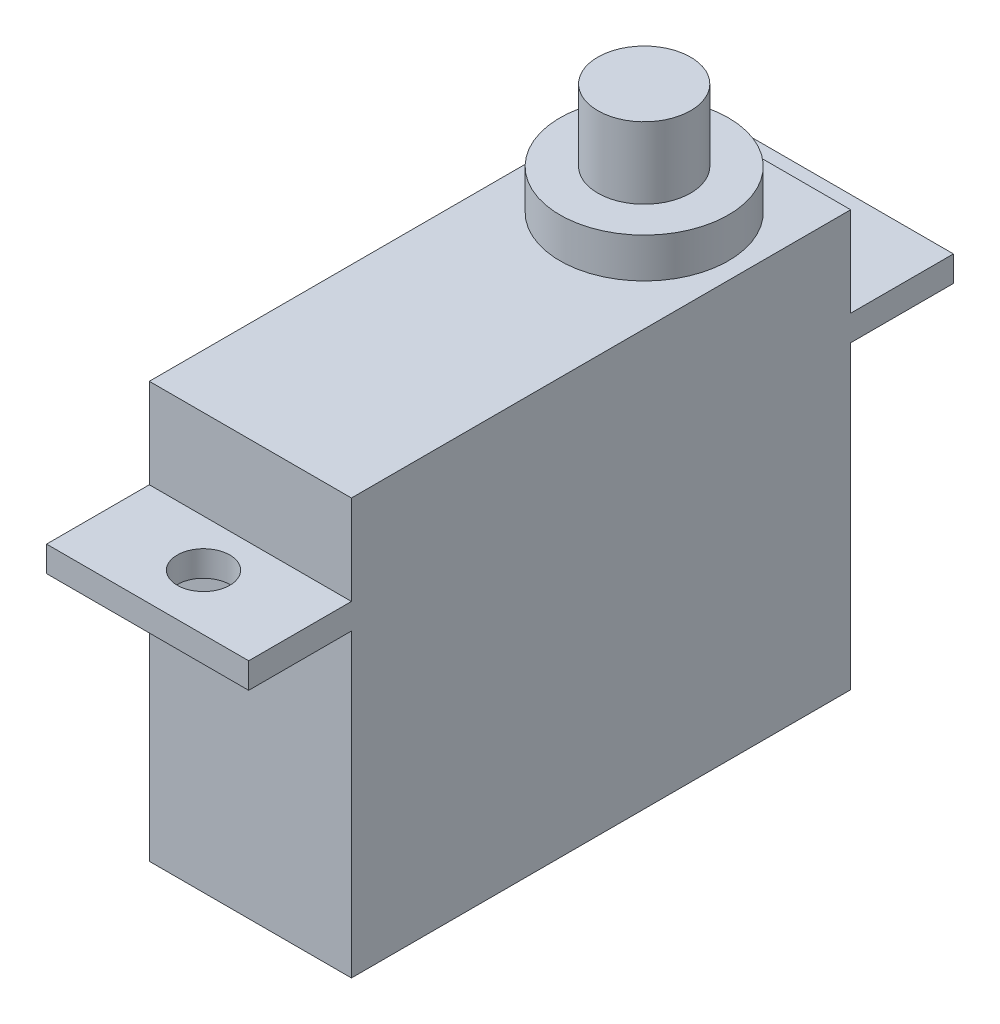
ISO-10303-21;
HEADER;
FILE_DESCRIPTION(('STEP AP214'),'2;1');
FILE_NAME('part.step','',(''),(''),'','','');
FILE_SCHEMA(('AUTOMOTIVE_DESIGN { 1 0 10303 214 1 1 1 1 }'));
ENDSEC;
DATA;
#1=APPLICATION_CONTEXT('core data for automotive mechanical design processes');
#2=APPLICATION_PROTOCOL_DEFINITION('international standard','automotive_design',2000,#1);
#3=PRODUCT_CONTEXT('',#1,'mechanical');
#4=PRODUCT('Part','Part','',(#3));
#5=PRODUCT_RELATED_PRODUCT_CATEGORY('part','',(#4));
#6=PRODUCT_DEFINITION_FORMATION('','',#4);
#7=PRODUCT_DEFINITION_CONTEXT('part definition',#1,'design');
#8=PRODUCT_DEFINITION('design','',#6,#7);
#9=PRODUCT_DEFINITION_SHAPE('','',#8);
#10=(LENGTH_UNIT() NAMED_UNIT(*) SI_UNIT(.MILLI.,.METRE.));
#11=(NAMED_UNIT(*) PLANE_ANGLE_UNIT() SI_UNIT($,.RADIAN.));
#12=(NAMED_UNIT(*) SI_UNIT($,.STERADIAN.) SOLID_ANGLE_UNIT());
#13=UNCERTAINTY_MEASURE_WITH_UNIT(LENGTH_MEASURE(1.E-05),#10,'distance_accuracy_value','');
#14=(GEOMETRIC_REPRESENTATION_CONTEXT(3) GLOBAL_UNCERTAINTY_ASSIGNED_CONTEXT((#13)) GLOBAL_UNIT_ASSIGNED_CONTEXT((#10,
#11,#12)) REPRESENTATION_CONTEXT('',''));
#15=CARTESIAN_POINT('',(0.,0.,0.));
#16=DIRECTION('',(0.,0.,1.));
#17=DIRECTION('',(1.,0.,0.));
#18=AXIS2_PLACEMENT_3D('',#15,#16,#17);
#19=CARTESIAN_POINT('',(3.81,17.1704,-14.8463));
#20=DIRECTION('',(0.,1.,0.));
#21=DIRECTION('',(0.,0.,1.));
#22=AXIS2_PLACEMENT_3D('',#19,#20,#21);
#23=PLANE('',#22);
#24=CARTESIAN_POINT('',(3.81,17.1704,-14.8463));
#25=DIRECTION('',(0.,1.,0.));
#26=DIRECTION('',(0.,0.,1.));
#27=AXIS2_PLACEMENT_3D('',#24,#25,#26);
#28=CIRCLE('',#27,3.175);
#29=CARTESIAN_POINT('',(3.81,17.1704,-18.0213));
#30=VERTEX_POINT('',#29);
#31=EDGE_CURVE('E346',#30,#30,#28,.T.);
#32=ORIENTED_EDGE('',*,*,#31,.T.);
#33=EDGE_LOOP('',(#32));
#34=FACE_BOUND('',#33,.T.);
#35=CARTESIAN_POINT('',(3.81,17.1704,-14.8463));
#36=DIRECTION('',(0.,1.,0.));
#37=DIRECTION('',(0.,0.,1.));
#38=AXIS2_PLACEMENT_3D('',#35,#36,#37);
#39=CIRCLE('',#38,1.75);
#40=CARTESIAN_POINT('',(3.81,17.1704,-13.0963));
#41=VERTEX_POINT('',#40);
#42=EDGE_CURVE('E350',#41,#41,#39,.T.);
#43=ORIENTED_EDGE('',*,*,#42,.F.);
#44=EDGE_LOOP('',(#43));
#45=FACE_BOUND('',#44,.T.);
#46=ADVANCED_FACE('F37',(#34,#45),#23,.T.);
#47=CARTESIAN_POINT('',(0.,15.6718,0.));
#48=DIRECTION('',(0.,-1.,0.));
#49=DIRECTION('',(0.,0.,-1.));
#50=AXIS2_PLACEMENT_3D('',#47,#48,#49);
#51=PLANE('',#50);
#52=DIRECTION('',(0.,0.,1.));
#53=VECTOR('',#52,1.);
#54=CARTESIAN_POINT('',(0.,15.6718,0.));
#55=LINE('',#54,#53);
#56=CARTESIAN_POINT('',(0.,15.6718,-18.8214));
#57=VERTEX_POINT('',#56);
#58=CARTESIAN_POINT('',(0.,15.6718,0.));
#59=VERTEX_POINT('',#58);
#60=EDGE_CURVE('E213',#57,#59,#55,.T.);
#61=ORIENTED_EDGE('',*,*,#60,.T.);
#62=DIRECTION('',(1.,0.,0.));
#63=VECTOR('',#62,1.);
#64=CARTESIAN_POINT('',(0.,15.6718,0.));
#65=LINE('',#64,#63);
#66=CARTESIAN_POINT('',(7.62,15.6718,0.));
#67=VERTEX_POINT('',#66);
#68=EDGE_CURVE('E216',#59,#67,#65,.T.);
#69=ORIENTED_EDGE('',*,*,#68,.T.);
#70=DIRECTION('',(0.,0.,-1.));
#71=VECTOR('',#70,1.);
#72=CARTESIAN_POINT('',(7.62,15.6718,0.));
#73=LINE('',#72,#71);
#74=CARTESIAN_POINT('',(7.62,15.6718,-18.8214));
#75=VERTEX_POINT('',#74);
#76=EDGE_CURVE('E219',#67,#75,#73,.T.);
#77=ORIENTED_EDGE('',*,*,#76,.T.);
#78=DIRECTION('',(-1.,0.,0.));
#79=VECTOR('',#78,1.);
#80=CARTESIAN_POINT('',(0.,15.6718,-18.8214));
#81=LINE('',#80,#79);
#82=EDGE_CURVE('E221',#75,#57,#81,.T.);
#83=ORIENTED_EDGE('',*,*,#82,.T.);
#84=EDGE_LOOP('',(#61,#69,#77,#83));
#85=FACE_BOUND('',#84,.T.);
#86=CARTESIAN_POINT('',(3.81,15.6718,-14.8463));
#87=DIRECTION('',(0.,-1.,0.));
#88=DIRECTION('',(0.,0.,-1.));
#89=AXIS2_PLACEMENT_3D('',#86,#87,#88);
#90=CIRCLE('',#89,3.175);
#91=CARTESIAN_POINT('',(3.81,15.6718,-18.0213));
#92=VERTEX_POINT('',#91);
#93=EDGE_CURVE('E11',#92,#92,#90,.F.);
#94=ORIENTED_EDGE('',*,*,#93,.F.);
#95=EDGE_LOOP('',(#94));
#96=FACE_BOUND('',#95,.T.);
#97=ADVANCED_FACE('F283',(#85,#96),#51,.F.);
#98=CARTESIAN_POINT('',(0.,15.6718,-18.8214));
#99=DIRECTION('',(0.,0.,1.));
#100=DIRECTION('',(1.,0.,0.));
#101=AXIS2_PLACEMENT_3D('',#98,#99,#100);
#102=PLANE('',#101);
#103=DIRECTION('',(1.,0.,0.));
#104=VECTOR('',#103,1.);
#105=CARTESIAN_POINT('',(0.,12.2936,-18.8214));
#106=LINE('',#105,#104);
#107=CARTESIAN_POINT('',(0.,12.2936,-18.8214));
#108=VERTEX_POINT('',#107);
#109=CARTESIAN_POINT('',(7.62,12.2936,-18.8214));
#110=VERTEX_POINT('',#109);
#111=EDGE_CURVE('E132',#108,#110,#106,.T.);
#112=ORIENTED_EDGE('',*,*,#111,.F.);
#113=DIRECTION('',(0.,-1.,0.));
#114=VECTOR('',#113,1.);
#115=CARTESIAN_POINT('',(0.,15.6718,-18.8214));
#116=LINE('',#115,#114);
#117=EDGE_CURVE('E239',#57,#108,#116,.T.);
#118=ORIENTED_EDGE('',*,*,#117,.F.);
#119=ORIENTED_EDGE('',*,*,#82,.F.);
#120=DIRECTION('',(0.,-1.,0.));
#121=VECTOR('',#120,1.);
#122=CARTESIAN_POINT('',(7.62,15.6718,-18.8214));
#123=LINE('',#122,#121);
#124=EDGE_CURVE('E246',#75,#110,#123,.T.);
#125=ORIENTED_EDGE('',*,*,#124,.T.);
#126=EDGE_LOOP('',(#112,#118,#119,#125));
#127=FACE_BOUND('',#126,.T.);
#128=ADVANCED_FACE('F278',(#127),#102,.F.);
#129=CARTESIAN_POINT('',(0.,15.6718,0.));
#130=DIRECTION('',(0.,0.,-1.));
#131=DIRECTION('',(-1.,0.,0.));
#132=AXIS2_PLACEMENT_3D('',#129,#130,#131);
#133=PLANE('',#132);
#134=DIRECTION('',(1.,0.,0.));
#135=VECTOR('',#134,1.);
#136=CARTESIAN_POINT('',(0.,11.3284,0.));
#137=LINE('',#136,#135);
#138=CARTESIAN_POINT('',(0.,11.3284,0.));
#139=VERTEX_POINT('',#138);
#140=CARTESIAN_POINT('',(7.62,11.3284,0.));
#141=VERTEX_POINT('',#140);
#142=EDGE_CURVE('E196',#139,#141,#137,.T.);
#143=ORIENTED_EDGE('',*,*,#142,.F.);
#144=DIRECTION('',(0.,-1.,0.));
#145=VECTOR('',#144,1.);
#146=CARTESIAN_POINT('',(0.,15.6718,0.));
#147=LINE('',#146,#145);
#148=CARTESIAN_POINT('',(0.,0.,0.));
#149=VERTEX_POINT('',#148);
#150=EDGE_CURVE('E263',#139,#149,#147,.T.);
#151=ORIENTED_EDGE('',*,*,#150,.T.);
#152=DIRECTION('',(1.,0.,0.));
#153=VECTOR('',#152,1.);
#154=CARTESIAN_POINT('',(0.,0.,0.));
#155=LINE('',#154,#153);
#156=CARTESIAN_POINT('',(7.62,0.,0.));
#157=VERTEX_POINT('',#156);
#158=EDGE_CURVE('E225',#149,#157,#155,.T.);
#159=ORIENTED_EDGE('',*,*,#158,.T.);
#160=DIRECTION('',(0.,-1.,0.));
#161=VECTOR('',#160,1.);
#162=CARTESIAN_POINT('',(7.62,15.6718,0.));
#163=LINE('',#162,#161);
#164=EDGE_CURVE('E262',#141,#157,#163,.T.);
#165=ORIENTED_EDGE('',*,*,#164,.F.);
#166=EDGE_LOOP('',(#143,#151,#159,#165));
#167=FACE_BOUND('',#166,.T.);
#168=ADVANCED_FACE('F261',(#167),#133,.F.);
#169=CARTESIAN_POINT('',(0.,15.6718,0.));
#170=DIRECTION('',(1.,0.,0.));
#171=DIRECTION('',(0.,0.,-1.));
#172=AXIS2_PLACEMENT_3D('',#169,#170,#171);
#173=PLANE('',#172);
#174=DIRECTION('',(0.,0.,1.));
#175=VECTOR('',#174,1.);
#176=CARTESIAN_POINT('',(0.,0.,0.));
#177=LINE('',#176,#175);
#178=CARTESIAN_POINT('',(0.,0.,-18.8214));
#179=VERTEX_POINT('',#178);
#180=EDGE_CURVE('E209',#179,#149,#177,.T.);
#181=ORIENTED_EDGE('',*,*,#180,.T.);
#182=ORIENTED_EDGE('',*,*,#150,.F.);
#183=DIRECTION('',(0.,0.,1.));
#184=VECTOR('',#183,1.);
#185=CARTESIAN_POINT('',(0.,11.3284,0.));
#186=LINE('',#185,#184);
#187=CARTESIAN_POINT('',(0.,11.3284,3.8735));
#188=VERTEX_POINT('',#187);
#189=EDGE_CURVE('E194',#139,#188,#186,.T.);
#190=ORIENTED_EDGE('',*,*,#189,.T.);
#191=DIRECTION('',(0.,-1.,0.));
#192=VECTOR('',#191,1.);
#193=CARTESIAN_POINT('',(0.,12.2936,3.8735));
#194=LINE('',#193,#192);
#195=CARTESIAN_POINT('',(0.,12.2936,3.8735));
#196=VERTEX_POINT('',#195);
#197=EDGE_CURVE('E210',#196,#188,#194,.T.);
#198=ORIENTED_EDGE('',*,*,#197,.F.);
#199=DIRECTION('',(0.,0.,1.));
#200=VECTOR('',#199,1.);
#201=CARTESIAN_POINT('',(0.,12.2936,0.));
#202=LINE('',#201,#200);
#203=CARTESIAN_POINT('',(0.,12.2936,0.));
#204=VERTEX_POINT('',#203);
#205=EDGE_CURVE('E177',#204,#196,#202,.T.);
#206=ORIENTED_EDGE('',*,*,#205,.F.);
#207=EDGE_CURVE('E45',#59,#204,#147,.T.);
#208=ORIENTED_EDGE('',*,*,#207,.F.);
#209=ORIENTED_EDGE('',*,*,#60,.F.);
#210=ORIENTED_EDGE('',*,*,#117,.T.);
#211=DIRECTION('',(0.,0.,-1.));
#212=VECTOR('',#211,1.);
#213=CARTESIAN_POINT('',(0.,12.2936,0.));
#214=LINE('',#213,#212);
#215=CARTESIAN_POINT('',(0.,12.2936,-22.6949));
#216=VERTEX_POINT('',#215);
#217=EDGE_CURVE('E146',#108,#216,#214,.T.);
#218=ORIENTED_EDGE('',*,*,#217,.T.);
#219=DIRECTION('',(0.,-1.,0.));
#220=VECTOR('',#219,1.);
#221=CARTESIAN_POINT('',(0.,12.2936,-22.6949));
#222=LINE('',#221,#220);
#223=CARTESIAN_POINT('',(0.,11.3284,-22.6949));
#224=VERTEX_POINT('',#223);
#225=EDGE_CURVE('E145',#216,#224,#222,.T.);
#226=ORIENTED_EDGE('',*,*,#225,.T.);
#227=DIRECTION('',(0.,0.,-1.));
#228=VECTOR('',#227,1.);
#229=CARTESIAN_POINT('',(0.,11.3284,0.));
#230=LINE('',#229,#228);
#231=CARTESIAN_POINT('',(0.,11.3284,-18.8214));
#232=VERTEX_POINT('',#231);
#233=EDGE_CURVE('E152',#232,#224,#230,.T.);
#234=ORIENTED_EDGE('',*,*,#233,.F.);
#235=EDGE_CURVE('E57',#232,#179,#116,.T.);
#236=ORIENTED_EDGE('',*,*,#235,.T.);
#237=EDGE_LOOP('',(#181,#182,#190,#198,#206,#208,#209,#210,#218,#226,#234,#236));
#238=FACE_BOUND('',#237,.T.);
#239=ADVANCED_FACE('F39',(#238),#173,.F.);
#240=ORIENTED_EDGE('',*,*,#207,.T.);
#241=DIRECTION('',(1.,0.,0.));
#242=VECTOR('',#241,1.);
#243=CARTESIAN_POINT('',(0.,12.2936,0.));
#244=LINE('',#243,#242);
#245=CARTESIAN_POINT('',(7.62,12.2936,0.));
#246=VERTEX_POINT('',#245);
#247=EDGE_CURVE('E184',#204,#246,#244,.T.);
#248=ORIENTED_EDGE('',*,*,#247,.T.);
#249=EDGE_CURVE('E264',#67,#246,#163,.T.);
#250=ORIENTED_EDGE('',*,*,#249,.F.);
#251=ORIENTED_EDGE('',*,*,#68,.F.);
#252=EDGE_LOOP('',(#240,#248,#250,#251));
#253=FACE_BOUND('',#252,.T.);
#254=ADVANCED_FACE('F287',(#253),#133,.F.);
#255=CARTESIAN_POINT('',(7.62,15.6718,0.));
#256=DIRECTION('',(-1.,0.,0.));
#257=DIRECTION('',(0.,0.,1.));
#258=AXIS2_PLACEMENT_3D('',#255,#256,#257);
#259=PLANE('',#258);
#260=DIRECTION('',(0.,0.,-1.));
#261=VECTOR('',#260,1.);
#262=CARTESIAN_POINT('',(7.62,0.,0.));
#263=LINE('',#262,#261);
#264=CARTESIAN_POINT('',(7.62,0.,-18.8214));
#265=VERTEX_POINT('',#264);
#266=EDGE_CURVE('E228',#157,#265,#263,.T.);
#267=ORIENTED_EDGE('',*,*,#266,.T.);
#268=CARTESIAN_POINT('',(7.62,11.3284,-18.8214));
#269=VERTEX_POINT('',#268);
#270=EDGE_CURVE('E241',#269,#265,#123,.T.);
#271=ORIENTED_EDGE('',*,*,#270,.F.);
#272=DIRECTION('',(0.,0.,-1.));
#273=VECTOR('',#272,1.);
#274=CARTESIAN_POINT('',(7.62,11.3284,0.));
#275=LINE('',#274,#273);
#276=CARTESIAN_POINT('',(7.62,11.3284,-22.6949));
#277=VERTEX_POINT('',#276);
#278=EDGE_CURVE('E141',#269,#277,#275,.T.);
#279=ORIENTED_EDGE('',*,*,#278,.T.);
#280=DIRECTION('',(0.,-1.,0.));
#281=VECTOR('',#280,1.);
#282=CARTESIAN_POINT('',(7.62,12.2936,-22.6949));
#283=LINE('',#282,#281);
#284=CARTESIAN_POINT('',(7.62,12.2936,-22.6949));
#285=VERTEX_POINT('',#284);
#286=EDGE_CURVE('E137',#285,#277,#283,.T.);
#287=ORIENTED_EDGE('',*,*,#286,.F.);
#288=DIRECTION('',(0.,0.,-1.));
#289=VECTOR('',#288,1.);
#290=CARTESIAN_POINT('',(7.62,12.2936,0.));
#291=LINE('',#290,#289);
#292=EDGE_CURVE('E125',#110,#285,#291,.T.);
#293=ORIENTED_EDGE('',*,*,#292,.F.);
#294=ORIENTED_EDGE('',*,*,#124,.F.);
#295=ORIENTED_EDGE('',*,*,#76,.F.);
#296=ORIENTED_EDGE('',*,*,#249,.T.);
#297=DIRECTION('',(0.,0.,1.));
#298=VECTOR('',#297,1.);
#299=CARTESIAN_POINT('',(7.62,12.2936,0.));
#300=LINE('',#299,#298);
#301=CARTESIAN_POINT('',(7.62,12.2936,3.8735));
#302=VERTEX_POINT('',#301);
#303=EDGE_CURVE('E188',#246,#302,#300,.T.);
#304=ORIENTED_EDGE('',*,*,#303,.T.);
#305=DIRECTION('',(0.,-1.,0.));
#306=VECTOR('',#305,1.);
#307=CARTESIAN_POINT('',(7.62,12.2936,3.8735));
#308=LINE('',#307,#306);
#309=CARTESIAN_POINT('',(7.62,11.3284,3.8735));
#310=VERTEX_POINT('',#309);
#311=EDGE_CURVE('E207',#302,#310,#308,.T.);
#312=ORIENTED_EDGE('',*,*,#311,.T.);
#313=DIRECTION('',(0.,0.,1.));
#314=VECTOR('',#313,1.);
#315=CARTESIAN_POINT('',(7.62,11.3284,0.));
#316=LINE('',#315,#314);
#317=EDGE_CURVE('E201',#141,#310,#316,.T.);
#318=ORIENTED_EDGE('',*,*,#317,.F.);
#319=ORIENTED_EDGE('',*,*,#164,.T.);
#320=EDGE_LOOP('',(#267,#271,#279,#287,#293,#294,#295,#296,#304,#312,#318,#319));
#321=FACE_BOUND('',#320,.T.);
#322=ADVANCED_FACE('F139',(#321),#259,.F.);
#323=ORIENTED_EDGE('',*,*,#235,.F.);
#324=DIRECTION('',(1.,0.,0.));
#325=VECTOR('',#324,1.);
#326=CARTESIAN_POINT('',(0.,11.3284,-18.8214));
#327=LINE('',#326,#325);
#328=EDGE_CURVE('E52',#232,#269,#327,.T.);
#329=ORIENTED_EDGE('',*,*,#328,.T.);
#330=ORIENTED_EDGE('',*,*,#270,.T.);
#331=DIRECTION('',(-1.,0.,0.));
#332=VECTOR('',#331,1.);
#333=CARTESIAN_POINT('',(0.,0.,-18.8214));
#334=LINE('',#333,#332);
#335=EDGE_CURVE('E217',#265,#179,#334,.T.);
#336=ORIENTED_EDGE('',*,*,#335,.T.);
#337=EDGE_LOOP('',(#323,#329,#330,#336));
#338=FACE_BOUND('',#337,.T.);
#339=ADVANCED_FACE('F253',(#338),#102,.F.);
#340=CARTESIAN_POINT('',(0.,0.,0.));
#341=DIRECTION('',(0.,-1.,0.));
#342=DIRECTION('',(0.,0.,-1.));
#343=AXIS2_PLACEMENT_3D('',#340,#341,#342);
#344=PLANE('',#343);
#345=ORIENTED_EDGE('',*,*,#180,.F.);
#346=ORIENTED_EDGE('',*,*,#335,.F.);
#347=ORIENTED_EDGE('',*,*,#266,.F.);
#348=ORIENTED_EDGE('',*,*,#158,.F.);
#349=EDGE_LOOP('',(#345,#346,#347,#348));
#350=FACE_BOUND('',#349,.T.);
#351=ADVANCED_FACE('F257',(#350),#344,.T.);
#352=CARTESIAN_POINT('',(0.,12.2936,3.8735));
#353=DIRECTION('',(0.,0.,-1.));
#354=DIRECTION('',(-1.,0.,0.));
#355=AXIS2_PLACEMENT_3D('',#352,#353,#354);
#356=PLANE('',#355);
#357=DIRECTION('',(1.,0.,0.));
#358=VECTOR('',#357,1.);
#359=CARTESIAN_POINT('',(0.,11.3284,3.8735));
#360=LINE('',#359,#358);
#361=EDGE_CURVE('E173',#188,#310,#360,.T.);
#362=ORIENTED_EDGE('',*,*,#361,.T.);
#363=ORIENTED_EDGE('',*,*,#311,.F.);
#364=DIRECTION('',(1.,0.,0.));
#365=VECTOR('',#364,1.);
#366=CARTESIAN_POINT('',(0.,12.2936,3.8735));
#367=LINE('',#366,#365);
#368=EDGE_CURVE('E175',#196,#302,#367,.T.);
#369=ORIENTED_EDGE('',*,*,#368,.F.);
#370=ORIENTED_EDGE('',*,*,#197,.T.);
#371=EDGE_LOOP('',(#362,#363,#369,#370));
#372=FACE_BOUND('',#371,.T.);
#373=ADVANCED_FACE('F309',(#372),#356,.F.);
#374=CARTESIAN_POINT('',(3.81,12.2936,1.7653));
#375=DIRECTION('',(0.,-1.,0.));
#376=DIRECTION('',(0.,0.,-1.));
#377=AXIS2_PLACEMENT_3D('',#374,#375,#376);
#378=CYLINDRICAL_SURFACE('',#377,0.990600000000004);
#379=CARTESIAN_POINT('',(3.81,12.2936,1.7653));
#380=DIRECTION('',(0.,-1.,0.));
#381=DIRECTION('',(0.,0.,-1.));
#382=AXIS2_PLACEMENT_3D('',#379,#380,#381);
#383=CIRCLE('',#382,0.990600000000004);
#384=CARTESIAN_POINT('',(3.81,12.2936,0.774699999999997));
#385=VERTEX_POINT('',#384);
#386=EDGE_CURVE('E181',#385,#385,#383,.F.);
#387=CARTESIAN_POINT('',(3.81,11.3284,1.7653));
#388=DIRECTION('',(0.,-1.,0.));
#389=DIRECTION('',(0.,0.,-1.));
#390=AXIS2_PLACEMENT_3D('',#387,#388,#389);
#391=CIRCLE('',#390,0.990600000000004);
#392=CARTESIAN_POINT('',(3.81,11.3284,0.774699999999997));
#393=VERTEX_POINT('',#392);
#394=EDGE_CURVE('E178',#393,#393,#391,.F.);
#395=CARTESIAN_POINT('',(3.81,12.2936,0.774699999999997));
#396=CARTESIAN_POINT('',(3.81,12.2835458333333,0.774699999999997));
#397=CARTESIAN_POINT('',(3.81,12.2734916666667,0.774699999999997));
#398=CARTESIAN_POINT('',(3.81,12.2533833333333,0.774699999999997));
#399=CARTESIAN_POINT('',(3.81,12.2433291666667,0.774699999999997));
#400=CARTESIAN_POINT('',(3.81,12.2232208333333,0.774699999999997));
#401=CARTESIAN_POINT('',(3.81,12.2131666666667,0.774699999999997));
#402=CARTESIAN_POINT('',(3.81,12.1930583333333,0.774699999999997));
#403=CARTESIAN_POINT('',(3.81,12.1830041666667,0.774699999999997));
#404=CARTESIAN_POINT('',(3.81,12.1628958333333,0.774699999999997));
#405=CARTESIAN_POINT('',(3.81,12.1528416666667,0.774699999999997));
#406=CARTESIAN_POINT('',(3.81,12.1327333333333,0.774699999999997));
#407=CARTESIAN_POINT('',(3.81,12.1226791666667,0.774699999999997));
#408=CARTESIAN_POINT('',(3.81,12.1025708333333,0.774699999999997));
#409=CARTESIAN_POINT('',(3.81,12.0925166666667,0.774699999999997));
#410=CARTESIAN_POINT('',(3.81,12.0724083333333,0.774699999999997));
#411=CARTESIAN_POINT('',(3.81,12.0623541666667,0.774699999999997));
#412=CARTESIAN_POINT('',(3.81,12.0422458333333,0.774699999999997));
#413=CARTESIAN_POINT('',(3.81,12.0321916666667,0.774699999999997));
#414=CARTESIAN_POINT('',(3.81,12.0120833333333,0.774699999999997));
#415=CARTESIAN_POINT('',(3.81,12.0020291666667,0.774699999999997));
#416=CARTESIAN_POINT('',(3.81,11.9819208333333,0.774699999999997));
#417=CARTESIAN_POINT('',(3.81,11.9718666666667,0.774699999999997));
#418=CARTESIAN_POINT('',(3.81,11.9517583333333,0.774699999999997));
#419=CARTESIAN_POINT('',(3.81,11.9417041666667,0.774699999999997));
#420=CARTESIAN_POINT('',(3.81,11.9215958333333,0.774699999999997));
#421=CARTESIAN_POINT('',(3.81,11.9115416666667,0.774699999999997));
#422=CARTESIAN_POINT('',(3.81,11.8914333333333,0.774699999999997));
#423=CARTESIAN_POINT('',(3.81,11.8813791666667,0.774699999999997));
#424=CARTESIAN_POINT('',(3.81,11.8612708333333,0.774699999999997));
#425=CARTESIAN_POINT('',(3.81,11.8512166666667,0.774699999999997));
#426=CARTESIAN_POINT('',(3.81,11.8311083333333,0.774699999999997));
#427=CARTESIAN_POINT('',(3.81,11.8210541666667,0.774699999999997));
#428=CARTESIAN_POINT('',(3.81,11.8009458333333,0.774699999999997));
#429=CARTESIAN_POINT('',(3.81,11.7908916666667,0.774699999999997));
#430=CARTESIAN_POINT('',(3.81,11.7707833333333,0.774699999999997));
#431=CARTESIAN_POINT('',(3.81,11.7607291666667,0.774699999999997));
#432=CARTESIAN_POINT('',(3.81,11.7406208333333,0.774699999999997));
#433=CARTESIAN_POINT('',(3.81,11.7305666666667,0.774699999999997));
#434=CARTESIAN_POINT('',(3.81,11.7104583333333,0.774699999999997));
#435=CARTESIAN_POINT('',(3.81,11.7004041666667,0.774699999999997));
#436=CARTESIAN_POINT('',(3.81,11.6802958333333,0.774699999999997));
#437=CARTESIAN_POINT('',(3.81,11.6702416666667,0.774699999999997));
#438=CARTESIAN_POINT('',(3.81,11.6501333333333,0.774699999999997));
#439=CARTESIAN_POINT('',(3.81,11.6400791666667,0.774699999999997));
#440=CARTESIAN_POINT('',(3.81,11.6199708333333,0.774699999999997));
#441=CARTESIAN_POINT('',(3.81,11.6099166666667,0.774699999999997));
#442=CARTESIAN_POINT('',(3.81,11.5898083333333,0.774699999999997));
#443=CARTESIAN_POINT('',(3.81,11.5797541666667,0.774699999999997));
#444=CARTESIAN_POINT('',(3.81,11.5596458333333,0.774699999999997));
#445=CARTESIAN_POINT('',(3.81,11.5495916666667,0.774699999999997));
#446=CARTESIAN_POINT('',(3.81,11.5294833333333,0.774699999999997));
#447=CARTESIAN_POINT('',(3.81,11.5194291666667,0.774699999999997));
#448=CARTESIAN_POINT('',(3.81,11.4993208333333,0.774699999999997));
#449=CARTESIAN_POINT('',(3.81,11.4892666666667,0.774699999999997));
#450=CARTESIAN_POINT('',(3.81,11.4691583333333,0.774699999999997));
#451=CARTESIAN_POINT('',(3.81,11.4591041666667,0.774699999999997));
#452=CARTESIAN_POINT('',(3.81,11.4389958333333,0.774699999999997));
#453=CARTESIAN_POINT('',(3.81,11.4289416666667,0.774699999999997));
#454=CARTESIAN_POINT('',(3.81,11.4088333333333,0.774699999999997));
#455=CARTESIAN_POINT('',(3.81,11.3987791666667,0.774699999999997));
#456=CARTESIAN_POINT('',(3.81,11.3786708333333,0.774699999999997));
#457=CARTESIAN_POINT('',(3.81,11.3686166666667,0.774699999999997));
#458=CARTESIAN_POINT('',(3.81,11.3485083333333,0.774699999999997));
#459=CARTESIAN_POINT('',(3.81,11.3384541666667,0.774699999999997));
#460=CARTESIAN_POINT('',(3.81,11.3284,0.774699999999997));
#461=B_SPLINE_CURVE_WITH_KNOTS('',3,(#395,#396,#397,#398,#399,#400,#401,#402,#403,#404,#405,
#406,#407,#408,#409,#410,#411,#412,#413,#414,#415,#416,#417,#418,#419,#420,#421,#422,#423,#424,
#425,#426,#427,#428,#429,#430,#431,#432,#433,#434,#435,#436,#437,#438,#439,#440,#441,#442,#443,
#444,#445,#446,#447,#448,#449,#450,#451,#452,#453,#454,#455,#456,#457,#458,#459,#460),
.UNSPECIFIED.,.F.,.F.,(4,2,2,2,2,2,2,2,2,2,2,2,2,2,2,2,2,2,2,2,2,2,2,2,2,2,2,2,2,2,2,2,4),(0.,
0.0301625000000017,0.0603250000000017,0.0904875000000017,0.120650000000002,0.1508125,
0.180975000000002,0.211137500000002,0.241300000000002,0.2714625,0.301625,0.3317875,
0.361950000000001,0.392112500000001,0.422275000000001,0.452437500000001,0.482600000000001,
0.5127625,0.542925,0.5730875,0.60325,0.6334125,0.663575,0.6937375,0.723900000000001,
0.754062500000001,0.784225000000001,0.814387500000001,0.844550000000001,0.874712500000001,
0.904875000000001,0.935037500000001,0.965200000000001),.UNSPECIFIED.);
#462=EDGE_CURVE('BSEAM298',#385,#393,#461,.T.);
#463=ORIENTED_EDGE('',*,*,#386,.T.);
#464=ORIENTED_EDGE('',*,*,#394,.F.);
#465=ORIENTED_EDGE('',*,*,#462,.T.);
#466=ORIENTED_EDGE('',*,*,#462,.F.);
#467=EDGE_LOOP('',(#463,#465,#464,#466));
#468=FACE_BOUND('',#467,.T.);
#469=ADVANCED_FACE('F298',(#468),#378,.F.);
#470=CARTESIAN_POINT('',(0.,12.2936,0.));
#471=DIRECTION('',(0.,-1.,0.));
#472=DIRECTION('',(0.,0.,-1.));
#473=AXIS2_PLACEMENT_3D('',#470,#471,#472);
#474=PLANE('',#473);
#475=ORIENTED_EDGE('',*,*,#368,.T.);
#476=ORIENTED_EDGE('',*,*,#303,.F.);
#477=ORIENTED_EDGE('',*,*,#247,.F.);
#478=ORIENTED_EDGE('',*,*,#205,.T.);
#479=EDGE_LOOP('',(#475,#476,#477,#478));
#480=FACE_BOUND('',#479,.T.);
#481=ORIENTED_EDGE('',*,*,#386,.F.);
#482=EDGE_LOOP('',(#481));
#483=FACE_BOUND('',#482,.T.);
#484=ADVANCED_FACE('F290',(#480,#483),#474,.F.);
#485=CARTESIAN_POINT('',(0.,11.3284,0.));
#486=DIRECTION('',(0.,-1.,0.));
#487=DIRECTION('',(0.,0.,-1.));
#488=AXIS2_PLACEMENT_3D('',#485,#486,#487);
#489=PLANE('',#488);
#490=ORIENTED_EDGE('',*,*,#361,.F.);
#491=ORIENTED_EDGE('',*,*,#189,.F.);
#492=ORIENTED_EDGE('',*,*,#142,.T.);
#493=ORIENTED_EDGE('',*,*,#317,.T.);
#494=EDGE_LOOP('',(#490,#491,#492,#493));
#495=FACE_BOUND('',#494,.T.);
#496=ORIENTED_EDGE('',*,*,#394,.T.);
#497=EDGE_LOOP('',(#496));
#498=FACE_BOUND('',#497,.T.);
#499=ADVANCED_FACE('F301',(#495,#498),#489,.T.);
#500=CARTESIAN_POINT('',(0.,12.2936,-22.6949));
#501=DIRECTION('',(0.,0.,-1.));
#502=DIRECTION('',(-1.,0.,0.));
#503=AXIS2_PLACEMENT_3D('',#500,#501,#502);
#504=PLANE('',#503);
#505=DIRECTION('',(1.,0.,0.));
#506=VECTOR('',#505,1.);
#507=CARTESIAN_POINT('',(0.,11.3284,-22.6949));
#508=LINE('',#507,#506);
#509=EDGE_CURVE('E172',#224,#277,#508,.T.);
#510=ORIENTED_EDGE('',*,*,#509,.F.);
#511=ORIENTED_EDGE('',*,*,#225,.F.);
#512=DIRECTION('',(1.,0.,0.));
#513=VECTOR('',#512,1.);
#514=CARTESIAN_POINT('',(0.,12.2936,-22.6949));
#515=LINE('',#514,#513);
#516=EDGE_CURVE('E130',#216,#285,#515,.T.);
#517=ORIENTED_EDGE('',*,*,#516,.T.);
#518=ORIENTED_EDGE('',*,*,#286,.T.);
#519=EDGE_LOOP('',(#510,#511,#517,#518));
#520=FACE_BOUND('',#519,.T.);
#521=ADVANCED_FACE('F148',(#520),#504,.T.);
#522=CARTESIAN_POINT('',(3.81,12.2936,-20.5867));
#523=DIRECTION('',(0.,-1.,0.));
#524=DIRECTION('',(0.,0.,-1.));
#525=AXIS2_PLACEMENT_3D('',#522,#523,#524);
#526=CYLINDRICAL_SURFACE('',#525,0.990600000000004);
#527=CARTESIAN_POINT('',(3.81,12.2936,-20.5867));
#528=DIRECTION('',(0.,-1.,0.));
#529=DIRECTION('',(0.,0.,-1.));
#530=AXIS2_PLACEMENT_3D('',#527,#528,#529);
#531=CIRCLE('',#530,0.990600000000004);
#532=CARTESIAN_POINT('',(3.81,12.2936,-21.5773));
#533=VERTEX_POINT('',#532);
#534=EDGE_CURVE('E149',#533,#533,#531,.T.);
#535=CARTESIAN_POINT('',(3.81,11.3284,-20.5867));
#536=DIRECTION('',(0.,-1.,0.));
#537=DIRECTION('',(0.,0.,-1.));
#538=AXIS2_PLACEMENT_3D('',#535,#536,#537);
#539=CIRCLE('',#538,0.990600000000004);
#540=CARTESIAN_POINT('',(3.81,11.3284,-21.5773));
#541=VERTEX_POINT('',#540);
#542=EDGE_CURVE('E158',#541,#541,#539,.T.);
#543=CARTESIAN_POINT('',(3.81,12.2936,-21.5773));
#544=CARTESIAN_POINT('',(3.81,12.2835458333333,-21.5773));
#545=CARTESIAN_POINT('',(3.81,12.2734916666667,-21.5773));
#546=CARTESIAN_POINT('',(3.81,12.2533833333333,-21.5773));
#547=CARTESIAN_POINT('',(3.81,12.2433291666667,-21.5773));
#548=CARTESIAN_POINT('',(3.81,12.2232208333333,-21.5773));
#549=CARTESIAN_POINT('',(3.81,12.2131666666667,-21.5773));
#550=CARTESIAN_POINT('',(3.81,12.1930583333333,-21.5773));
#551=CARTESIAN_POINT('',(3.81,12.1830041666667,-21.5773));
#552=CARTESIAN_POINT('',(3.81,12.1628958333333,-21.5773));
#553=CARTESIAN_POINT('',(3.81,12.1528416666667,-21.5773));
#554=CARTESIAN_POINT('',(3.81,12.1327333333333,-21.5773));
#555=CARTESIAN_POINT('',(3.81,12.1226791666667,-21.5773));
#556=CARTESIAN_POINT('',(3.81,12.1025708333333,-21.5773));
#557=CARTESIAN_POINT('',(3.81,12.0925166666667,-21.5773));
#558=CARTESIAN_POINT('',(3.81,12.0724083333333,-21.5773));
#559=CARTESIAN_POINT('',(3.81,12.0623541666667,-21.5773));
#560=CARTESIAN_POINT('',(3.81,12.0422458333333,-21.5773));
#561=CARTESIAN_POINT('',(3.81,12.0321916666667,-21.5773));
#562=CARTESIAN_POINT('',(3.81,12.0120833333333,-21.5773));
#563=CARTESIAN_POINT('',(3.81,12.0020291666667,-21.5773));
#564=CARTESIAN_POINT('',(3.81,11.9819208333333,-21.5773));
#565=CARTESIAN_POINT('',(3.81,11.9718666666667,-21.5773));
#566=CARTESIAN_POINT('',(3.81,11.9517583333333,-21.5773));
#567=CARTESIAN_POINT('',(3.81,11.9417041666667,-21.5773));
#568=CARTESIAN_POINT('',(3.81,11.9215958333333,-21.5773));
#569=CARTESIAN_POINT('',(3.81,11.9115416666667,-21.5773));
#570=CARTESIAN_POINT('',(3.81,11.8914333333333,-21.5773));
#571=CARTESIAN_POINT('',(3.81,11.8813791666667,-21.5773));
#572=CARTESIAN_POINT('',(3.81,11.8612708333333,-21.5773));
#573=CARTESIAN_POINT('',(3.81,11.8512166666667,-21.5773));
#574=CARTESIAN_POINT('',(3.81,11.8311083333333,-21.5773));
#575=CARTESIAN_POINT('',(3.81,11.8210541666667,-21.5773));
#576=CARTESIAN_POINT('',(3.81,11.8009458333333,-21.5773));
#577=CARTESIAN_POINT('',(3.81,11.7908916666667,-21.5773));
#578=CARTESIAN_POINT('',(3.81,11.7707833333333,-21.5773));
#579=CARTESIAN_POINT('',(3.81,11.7607291666667,-21.5773));
#580=CARTESIAN_POINT('',(3.81,11.7406208333333,-21.5773));
#581=CARTESIAN_POINT('',(3.81,11.7305666666667,-21.5773));
#582=CARTESIAN_POINT('',(3.81,11.7104583333333,-21.5773));
#583=CARTESIAN_POINT('',(3.81,11.7004041666667,-21.5773));
#584=CARTESIAN_POINT('',(3.81,11.6802958333333,-21.5773));
#585=CARTESIAN_POINT('',(3.81,11.6702416666667,-21.5773));
#586=CARTESIAN_POINT('',(3.81,11.6501333333333,-21.5773));
#587=CARTESIAN_POINT('',(3.81,11.6400791666667,-21.5773));
#588=CARTESIAN_POINT('',(3.81,11.6199708333333,-21.5773));
#589=CARTESIAN_POINT('',(3.81,11.6099166666667,-21.5773));
#590=CARTESIAN_POINT('',(3.81,11.5898083333333,-21.5773));
#591=CARTESIAN_POINT('',(3.81,11.5797541666667,-21.5773));
#592=CARTESIAN_POINT('',(3.81,11.5596458333333,-21.5773));
#593=CARTESIAN_POINT('',(3.81,11.5495916666667,-21.5773));
#594=CARTESIAN_POINT('',(3.81,11.5294833333333,-21.5773));
#595=CARTESIAN_POINT('',(3.81,11.5194291666667,-21.5773));
#596=CARTESIAN_POINT('',(3.81,11.4993208333333,-21.5773));
#597=CARTESIAN_POINT('',(3.81,11.4892666666667,-21.5773));
#598=CARTESIAN_POINT('',(3.81,11.4691583333333,-21.5773));
#599=CARTESIAN_POINT('',(3.81,11.4591041666667,-21.5773));
#600=CARTESIAN_POINT('',(3.81,11.4389958333333,-21.5773));
#601=CARTESIAN_POINT('',(3.81,11.4289416666667,-21.5773));
#602=CARTESIAN_POINT('',(3.81,11.4088333333333,-21.5773));
#603=CARTESIAN_POINT('',(3.81,11.3987791666667,-21.5773));
#604=CARTESIAN_POINT('',(3.81,11.3786708333333,-21.5773));
#605=CARTESIAN_POINT('',(3.81,11.3686166666667,-21.5773));
#606=CARTESIAN_POINT('',(3.81,11.3485083333333,-21.5773));
#607=CARTESIAN_POINT('',(3.81,11.3384541666667,-21.5773));
#608=CARTESIAN_POINT('',(3.81,11.3284,-21.5773));
#609=B_SPLINE_CURVE_WITH_KNOTS('',3,(#543,#544,#545,#546,#547,#548,#549,#550,#551,#552,#553,
#554,#555,#556,#557,#558,#559,#560,#561,#562,#563,#564,#565,#566,#567,#568,#569,#570,#571,#572,
#573,#574,#575,#576,#577,#578,#579,#580,#581,#582,#583,#584,#585,#586,#587,#588,#589,#590,#591,
#592,#593,#594,#595,#596,#597,#598,#599,#600,#601,#602,#603,#604,#605,#606,#607,#608),
.UNSPECIFIED.,.F.,.F.,(4,2,2,2,2,2,2,2,2,2,2,2,2,2,2,2,2,2,2,2,2,2,2,2,2,2,2,2,2,2,2,2,4),(0.,
0.0301625000000017,0.0603250000000017,0.0904875000000017,0.120650000000002,0.1508125,
0.180975000000002,0.211137500000002,0.241300000000002,0.2714625,0.301625,0.3317875,
0.361950000000001,0.392112500000001,0.422275000000001,0.452437500000001,0.482600000000001,
0.5127625,0.542925,0.5730875,0.60325,0.6334125,0.663575,0.6937375,0.723900000000001,
0.754062500000001,0.784225000000001,0.814387500000001,0.844550000000001,0.874712500000001,
0.904875000000001,0.935037500000001,0.965200000000001),.UNSPECIFIED.);
#610=EDGE_CURVE('BSEAM332',#533,#541,#609,.T.);
#611=ORIENTED_EDGE('',*,*,#534,.F.);
#612=ORIENTED_EDGE('',*,*,#542,.T.);
#613=ORIENTED_EDGE('',*,*,#610,.T.);
#614=ORIENTED_EDGE('',*,*,#610,.F.);
#615=EDGE_LOOP('',(#611,#613,#612,#614));
#616=FACE_BOUND('',#615,.T.);
#617=ADVANCED_FACE('F332',(#616),#526,.F.);
#618=CARTESIAN_POINT('',(0.,12.2936,0.));
#619=DIRECTION('',(0.,-1.,0.));
#620=DIRECTION('',(0.,0.,-1.));
#621=AXIS2_PLACEMENT_3D('',#618,#619,#620);
#622=PLANE('',#621);
#623=ORIENTED_EDGE('',*,*,#534,.T.);
#624=EDGE_LOOP('',(#623));
#625=FACE_BOUND('',#624,.T.);
#626=ORIENTED_EDGE('',*,*,#516,.F.);
#627=ORIENTED_EDGE('',*,*,#217,.F.);
#628=ORIENTED_EDGE('',*,*,#111,.T.);
#629=ORIENTED_EDGE('',*,*,#292,.T.);
#630=EDGE_LOOP('',(#626,#627,#628,#629));
#631=FACE_BOUND('',#630,.T.);
#632=ADVANCED_FACE('F127',(#625,#631),#622,.F.);
#633=CARTESIAN_POINT('',(0.,11.3284,0.));
#634=DIRECTION('',(0.,-1.,0.));
#635=DIRECTION('',(0.,0.,-1.));
#636=AXIS2_PLACEMENT_3D('',#633,#634,#635);
#637=PLANE('',#636);
#638=ORIENTED_EDGE('',*,*,#542,.F.);
#639=EDGE_LOOP('',(#638));
#640=FACE_BOUND('',#639,.T.);
#641=ORIENTED_EDGE('',*,*,#509,.T.);
#642=ORIENTED_EDGE('',*,*,#278,.F.);
#643=ORIENTED_EDGE('',*,*,#328,.F.);
#644=ORIENTED_EDGE('',*,*,#233,.T.);
#645=EDGE_LOOP('',(#641,#642,#643,#644));
#646=FACE_BOUND('',#645,.T.);
#647=ADVANCED_FACE('F328',(#640,#646),#637,.T.);
#648=CARTESIAN_POINT('',(3.81,17.1704,-14.8463));
#649=DIRECTION('',(0.,-1.,0.));
#650=DIRECTION('',(0.,0.,-1.));
#651=AXIS2_PLACEMENT_3D('',#648,#649,#650);
#652=CYLINDRICAL_SURFACE('',#651,3.175);
#653=CARTESIAN_POINT('',(3.81,17.1704,-18.0213));
#654=CARTESIAN_POINT('',(3.81,17.1547895833333,-18.0213));
#655=CARTESIAN_POINT('',(3.81,17.1391791666667,-18.0213));
#656=CARTESIAN_POINT('',(3.81,17.1079583333333,-18.0213));
#657=CARTESIAN_POINT('',(3.81,17.0923479166667,-18.0213));
#658=CARTESIAN_POINT('',(3.81,17.0611270833333,-18.0213));
#659=CARTESIAN_POINT('',(3.81,17.0455166666667,-18.0213));
#660=CARTESIAN_POINT('',(3.81,17.0142958333333,-18.0213));
#661=CARTESIAN_POINT('',(3.81,16.9986854166667,-18.0213));
#662=CARTESIAN_POINT('',(3.81,16.9674645833333,-18.0213));
#663=CARTESIAN_POINT('',(3.81,16.9518541666667,-18.0213));
#664=CARTESIAN_POINT('',(3.81,16.9206333333333,-18.0213));
#665=CARTESIAN_POINT('',(3.81,16.9050229166667,-18.0213));
#666=CARTESIAN_POINT('',(3.81,16.8738020833333,-18.0213));
#667=CARTESIAN_POINT('',(3.81,16.8581916666667,-18.0213));
#668=CARTESIAN_POINT('',(3.81,16.8269708333333,-18.0213));
#669=CARTESIAN_POINT('',(3.81,16.8113604166667,-18.0213));
#670=CARTESIAN_POINT('',(3.81,16.7801395833333,-18.0213));
#671=CARTESIAN_POINT('',(3.81,16.7645291666667,-18.0213));
#672=CARTESIAN_POINT('',(3.81,16.7333083333333,-18.0213));
#673=CARTESIAN_POINT('',(3.81,16.7176979166667,-18.0213));
#674=CARTESIAN_POINT('',(3.81,16.6864770833333,-18.0213));
#675=CARTESIAN_POINT('',(3.81,16.6708666666667,-18.0213));
#676=CARTESIAN_POINT('',(3.81,16.6396458333333,-18.0213));
#677=CARTESIAN_POINT('',(3.81,16.6240354166667,-18.0213));
#678=CARTESIAN_POINT('',(3.81,16.5928145833333,-18.0213));
#679=CARTESIAN_POINT('',(3.81,16.5772041666667,-18.0213));
#680=CARTESIAN_POINT('',(3.81,16.5459833333333,-18.0213));
#681=CARTESIAN_POINT('',(3.81,16.5303729166667,-18.0213));
#682=CARTESIAN_POINT('',(3.81,16.4991520833333,-18.0213));
#683=CARTESIAN_POINT('',(3.81,16.4835416666667,-18.0213));
#684=CARTESIAN_POINT('',(3.81,16.4523208333333,-18.0213));
#685=CARTESIAN_POINT('',(3.81,16.4367104166667,-18.0213));
#686=CARTESIAN_POINT('',(3.81,16.4054895833333,-18.0213));
#687=CARTESIAN_POINT('',(3.81,16.3898791666667,-18.0213));
#688=CARTESIAN_POINT('',(3.81,16.3586583333333,-18.0213));
#689=CARTESIAN_POINT('',(3.81,16.3430479166667,-18.0213));
#690=CARTESIAN_POINT('',(3.81,16.3118270833333,-18.0213));
#691=CARTESIAN_POINT('',(3.81,16.2962166666667,-18.0213));
#692=CARTESIAN_POINT('',(3.81,16.2649958333333,-18.0213));
#693=CARTESIAN_POINT('',(3.81,16.2493854166667,-18.0213));
#694=CARTESIAN_POINT('',(3.81,16.2181645833333,-18.0213));
#695=CARTESIAN_POINT('',(3.81,16.2025541666667,-18.0213));
#696=CARTESIAN_POINT('',(3.81,16.1713333333333,-18.0213));
#697=CARTESIAN_POINT('',(3.81,16.1557229166667,-18.0213));
#698=CARTESIAN_POINT('',(3.81,16.1245020833333,-18.0213));
#699=CARTESIAN_POINT('',(3.81,16.1088916666667,-18.0213));
#700=CARTESIAN_POINT('',(3.81,16.0776708333333,-18.0213));
#701=CARTESIAN_POINT('',(3.81,16.0620604166667,-18.0213));
#702=CARTESIAN_POINT('',(3.81,16.0308395833333,-18.0213));
#703=CARTESIAN_POINT('',(3.81,16.0152291666667,-18.0213));
#704=CARTESIAN_POINT('',(3.81,15.9840083333333,-18.0213));
#705=CARTESIAN_POINT('',(3.81,15.9683979166667,-18.0213));
#706=CARTESIAN_POINT('',(3.81,15.9371770833333,-18.0213));
#707=CARTESIAN_POINT('',(3.81,15.9215666666667,-18.0213));
#708=CARTESIAN_POINT('',(3.81,15.8903458333333,-18.0213));
#709=CARTESIAN_POINT('',(3.81,15.8747354166667,-18.0213));
#710=CARTESIAN_POINT('',(3.81,15.8435145833333,-18.0213));
#711=CARTESIAN_POINT('',(3.81,15.8279041666667,-18.0213));
#712=CARTESIAN_POINT('',(3.81,15.7966833333333,-18.0213));
#713=CARTESIAN_POINT('',(3.81,15.7810729166667,-18.0213));
#714=CARTESIAN_POINT('',(3.81,15.7498520833333,-18.0213));
#715=CARTESIAN_POINT('',(3.81,15.7342416666667,-18.0213));
#716=CARTESIAN_POINT('',(3.81,15.7030208333333,-18.0213));
#717=CARTESIAN_POINT('',(3.81,15.6874104166667,-18.0213));
#718=CARTESIAN_POINT('',(3.81,15.6718,-18.0213));
#719=B_SPLINE_CURVE_WITH_KNOTS('',3,(#653,#654,#655,#656,#657,#658,#659,#660,#661,#662,#663,
#664,#665,#666,#667,#668,#669,#670,#671,#672,#673,#674,#675,#676,#677,#678,#679,#680,#681,#682,
#683,#684,#685,#686,#687,#688,#689,#690,#691,#692,#693,#694,#695,#696,#697,#698,#699,#700,#701,
#702,#703,#704,#705,#706,#707,#708,#709,#710,#711,#712,#713,#714,#715,#716,#717,#718),
.UNSPECIFIED.,.F.,.F.,(4,2,2,2,2,2,2,2,2,2,2,2,2,2,2,2,2,2,2,2,2,2,2,2,2,2,2,2,2,2,2,2,4),(0.,
0.0468312500000005,0.093662500000001,0.140493750000002,0.187325000000002,0.234156250000003,
0.2809875,0.32781875,0.374650000000001,0.421481250000001,0.468312500000002,0.515143749999999,
0.561974999999999,0.60880625,0.6556375,0.702468750000001,0.749299999999998,0.796131249999998,
0.842962499999999,0.889793749999999,0.936625,0.983456249999997,1.0302875,1.07711875,1.12395,
1.17078125,1.2176125,1.26444375,1.311275,1.35810625,1.4049375,1.45176875,1.4986),.UNSPECIFIED.);
#720=EDGE_CURVE('BSEAM325',#30,#92,#719,.T.);
#721=ORIENTED_EDGE('',*,*,#31,.F.);
#722=ORIENTED_EDGE('',*,*,#93,.T.);
#723=ORIENTED_EDGE('',*,*,#720,.T.);
#724=ORIENTED_EDGE('',*,*,#720,.F.);
#725=EDGE_LOOP('',(#721,#723,#722,#724));
#726=FACE_BOUND('',#725,.T.);
#727=ADVANCED_FACE('F325',(#726),#652,.T.);
#728=CARTESIAN_POINT('',(3.81,19.8628,-14.8463));
#729=DIRECTION('',(0.,-1.,0.));
#730=DIRECTION('',(0.,0.,-1.));
#731=AXIS2_PLACEMENT_3D('',#728,#729,#730);
#732=CYLINDRICAL_SURFACE('',#731,1.75);
#733=CARTESIAN_POINT('',(3.81,19.8628,-14.8463));
#734=DIRECTION('',(0.,1.,0.));
#735=DIRECTION('',(0.,0.,1.));
#736=AXIS2_PLACEMENT_3D('',#733,#734,#735);
#737=CIRCLE('',#736,1.75);
#738=CARTESIAN_POINT('',(3.81,19.8628,-13.0963));
#739=VERTEX_POINT('',#738);
#740=EDGE_CURVE('E347',#739,#739,#737,.T.);
#741=ORIENTED_EDGE('',*,*,#740,.F.);
#742=EDGE_LOOP('',(#741));
#743=FACE_BOUND('',#742,.T.);
#744=ORIENTED_EDGE('',*,*,#42,.T.);
#745=EDGE_LOOP('',(#744));
#746=FACE_BOUND('',#745,.T.);
#747=ADVANCED_FACE('F323',(#743,#746),#732,.T.);
#748=CARTESIAN_POINT('',(3.81,19.8628,-14.8463));
#749=DIRECTION('',(0.,1.,0.));
#750=DIRECTION('',(0.,0.,1.));
#751=AXIS2_PLACEMENT_3D('',#748,#749,#750);
#752=PLANE('',#751);
#753=ORIENTED_EDGE('',*,*,#740,.T.);
#754=EDGE_LOOP('',(#753));
#755=FACE_BOUND('',#754,.T.);
#756=ADVANCED_FACE('F357',(#755),#752,.T.);
#757=CLOSED_SHELL('',(#46,#97,#128,#168,#239,#254,#322,#339,#351,#373,#469,#484,#499,#521,#617,
#632,#647,#727,#747,#756));
#758=MANIFOLD_SOLID_BREP('B2',#757);
#759=ADVANCED_BREP_SHAPE_REPRESENTATION('',(#18,#758),#14);
#760=SHAPE_DEFINITION_REPRESENTATION(#9,#759);
ENDSEC;
END-ISO-10303-21;
